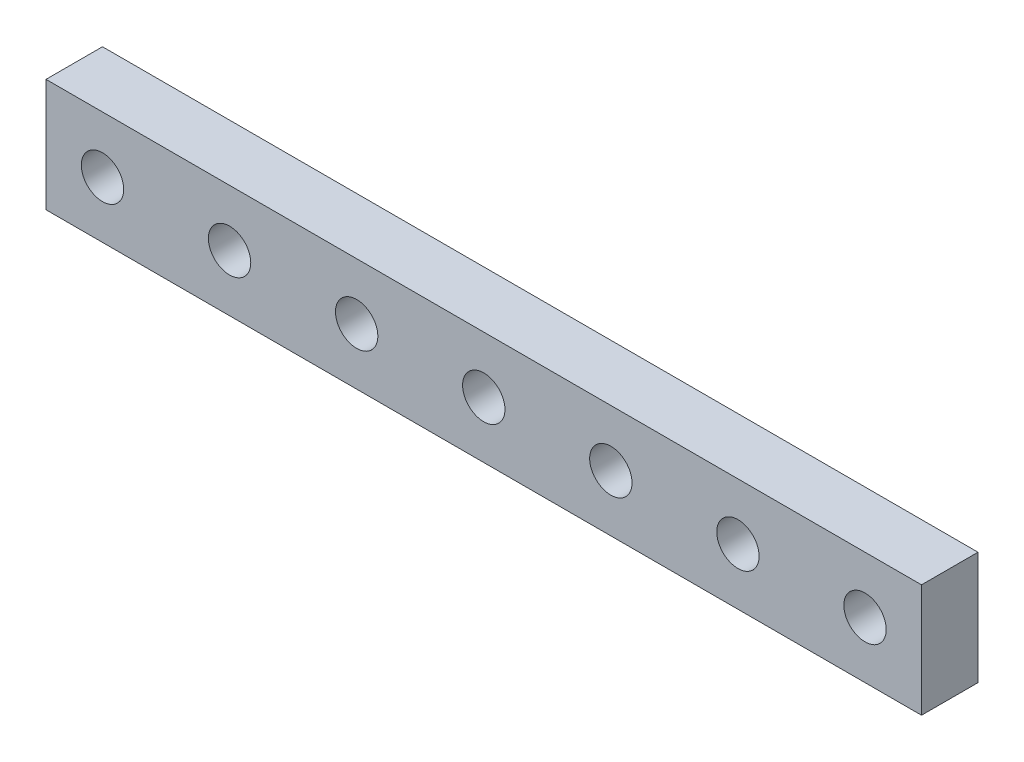
ISO-10303-21;
HEADER;
FILE_DESCRIPTION(('STEP AP214'),'2;1');
FILE_NAME('part.step','',(''),(''),'','','');
FILE_SCHEMA(('AUTOMOTIVE_DESIGN { 1 0 10303 214 1 1 1 1 }'));
ENDSEC;
DATA;
#1=APPLICATION_CONTEXT('core data for automotive mechanical design processes');
#2=APPLICATION_PROTOCOL_DEFINITION('international standard','automotive_design',2000,#1);
#3=PRODUCT_CONTEXT('',#1,'mechanical');
#4=PRODUCT('Part','Part','',(#3));
#5=PRODUCT_RELATED_PRODUCT_CATEGORY('part','',(#4));
#6=PRODUCT_DEFINITION_FORMATION('','',#4);
#7=PRODUCT_DEFINITION_CONTEXT('part definition',#1,'design');
#8=PRODUCT_DEFINITION('design','',#6,#7);
#9=PRODUCT_DEFINITION_SHAPE('','',#8);
#10=(LENGTH_UNIT() NAMED_UNIT(*) SI_UNIT(.MILLI.,.METRE.));
#11=(NAMED_UNIT(*) PLANE_ANGLE_UNIT() SI_UNIT($,.RADIAN.));
#12=(NAMED_UNIT(*) SI_UNIT($,.STERADIAN.) SOLID_ANGLE_UNIT());
#13=UNCERTAINTY_MEASURE_WITH_UNIT(LENGTH_MEASURE(1.E-05),#10,'distance_accuracy_value','');
#14=(GEOMETRIC_REPRESENTATION_CONTEXT(3) GLOBAL_UNCERTAINTY_ASSIGNED_CONTEXT((#13)) GLOBAL_UNIT_ASSIGNED_CONTEXT((#10,
#11,#12)) REPRESENTATION_CONTEXT('',''));
#15=CARTESIAN_POINT('',(0.,0.,0.));
#16=DIRECTION('',(0.,0.,1.));
#17=DIRECTION('',(1.,0.,0.));
#18=AXIS2_PLACEMENT_3D('',#15,#16,#17);
#19=CARTESIAN_POINT('',(0.,0.,4.));
#20=DIRECTION('',(0.,0.,-1.));
#21=DIRECTION('',(-1.,0.,0.));
#22=AXIS2_PLACEMENT_3D('',#19,#20,#21);
#23=PLANE('',#22);
#24=DIRECTION('',(0.,-1.,0.));
#25=VECTOR('',#24,1.);
#26=CARTESIAN_POINT('',(2551.34180854864,1588.06769153812,4.));
#27=LINE('',#26,#25);
#28=CARTESIAN_POINT('',(2551.34180854864,1596.06769153812,4.));
#29=VERTEX_POINT('',#28);
#30=CARTESIAN_POINT('',(2551.34180854864,1588.06769153812,4.));
#31=VERTEX_POINT('',#30);
#32=EDGE_CURVE('E89',#29,#31,#27,.T.);
#33=ORIENTED_EDGE('',*,*,#32,.T.);
#34=DIRECTION('',(1.,0.,0.));
#35=VECTOR('',#34,1.);
#36=CARTESIAN_POINT('',(2613.34180854864,1588.06769153812,4.));
#37=LINE('',#36,#35);
#38=CARTESIAN_POINT('',(2613.34180854864,1588.06769153812,4.));
#39=VERTEX_POINT('',#38);
#40=EDGE_CURVE('E84',#31,#39,#37,.T.);
#41=ORIENTED_EDGE('',*,*,#40,.T.);
#42=DIRECTION('',(0.,1.,0.));
#43=VECTOR('',#42,1.);
#44=CARTESIAN_POINT('',(2613.34180854864,1596.06769153812,4.));
#45=LINE('',#44,#43);
#46=CARTESIAN_POINT('',(2613.34180854864,1596.06769153812,4.));
#47=VERTEX_POINT('',#46);
#48=EDGE_CURVE('E87',#39,#47,#45,.T.);
#49=ORIENTED_EDGE('',*,*,#48,.T.);
#50=DIRECTION('',(-1.,0.,0.));
#51=VECTOR('',#50,1.);
#52=CARTESIAN_POINT('',(2551.34180854864,1596.06769153812,4.));
#53=LINE('',#52,#51);
#54=EDGE_CURVE('E54',#47,#29,#53,.T.);
#55=ORIENTED_EDGE('',*,*,#54,.T.);
#56=EDGE_LOOP('',(#33,#41,#49,#55));
#57=FACE_BOUND('',#56,.T.);
#58=CARTESIAN_POINT('',(2555.34180854864,1592.06769153812,4.));
#59=DIRECTION('',(0.,0.,1.));
#60=DIRECTION('',(1.,0.,0.));
#61=AXIS2_PLACEMENT_3D('',#58,#59,#60);
#62=CIRCLE('',#61,1.50000000000006);
#63=CARTESIAN_POINT('',(2556.84180854864,1592.06769153812,4.));
#64=VERTEX_POINT('',#63);
#65=EDGE_CURVE('E104',#64,#64,#62,.T.);
#66=ORIENTED_EDGE('',*,*,#65,.F.);
#67=EDGE_LOOP('',(#66));
#68=FACE_BOUND('',#67,.T.);
#69=CARTESIAN_POINT('',(2564.34180854864,1592.06769153812,4.));
#70=DIRECTION('',(0.,0.,1.));
#71=DIRECTION('',(1.,0.,0.));
#72=AXIS2_PLACEMENT_3D('',#69,#70,#71);
#73=CIRCLE('',#72,1.50000000000006);
#74=CARTESIAN_POINT('',(2565.84180854864,1592.06769153812,4.));
#75=VERTEX_POINT('',#74);
#76=EDGE_CURVE('E119',#75,#75,#73,.T.);
#77=ORIENTED_EDGE('',*,*,#76,.F.);
#78=EDGE_LOOP('',(#77));
#79=FACE_BOUND('',#78,.T.);
#80=CARTESIAN_POINT('',(2573.34180854864,1592.06769153812,4.));
#81=DIRECTION('',(0.,0.,1.));
#82=DIRECTION('',(1.,0.,0.));
#83=AXIS2_PLACEMENT_3D('',#80,#81,#82);
#84=CIRCLE('',#83,1.50000000000006);
#85=CARTESIAN_POINT('',(2574.84180854864,1592.06769153812,4.));
#86=VERTEX_POINT('',#85);
#87=EDGE_CURVE('E125',#86,#86,#84,.T.);
#88=ORIENTED_EDGE('',*,*,#87,.F.);
#89=EDGE_LOOP('',(#88));
#90=FACE_BOUND('',#89,.T.);
#91=CARTESIAN_POINT('',(2582.34180854864,1592.06769153812,4.));
#92=DIRECTION('',(0.,0.,1.));
#93=DIRECTION('',(1.,0.,0.));
#94=AXIS2_PLACEMENT_3D('',#91,#92,#93);
#95=CIRCLE('',#94,1.50000000000006);
#96=CARTESIAN_POINT('',(2583.84180854864,1592.06769153812,4.));
#97=VERTEX_POINT('',#96);
#98=EDGE_CURVE('E131',#97,#97,#95,.T.);
#99=ORIENTED_EDGE('',*,*,#98,.F.);
#100=EDGE_LOOP('',(#99));
#101=FACE_BOUND('',#100,.T.);
#102=CARTESIAN_POINT('',(2591.34180854864,1592.06769153812,4.));
#103=DIRECTION('',(0.,0.,1.));
#104=DIRECTION('',(1.,0.,0.));
#105=AXIS2_PLACEMENT_3D('',#102,#103,#104);
#106=CIRCLE('',#105,1.50000000000006);
#107=CARTESIAN_POINT('',(2592.84180854864,1592.06769153812,4.));
#108=VERTEX_POINT('',#107);
#109=EDGE_CURVE('E137',#108,#108,#106,.T.);
#110=ORIENTED_EDGE('',*,*,#109,.F.);
#111=EDGE_LOOP('',(#110));
#112=FACE_BOUND('',#111,.T.);
#113=CARTESIAN_POINT('',(2600.34180854864,1592.06769153812,4.));
#114=DIRECTION('',(0.,0.,1.));
#115=DIRECTION('',(1.,0.,0.));
#116=AXIS2_PLACEMENT_3D('',#113,#114,#115);
#117=CIRCLE('',#116,1.50000000000006);
#118=CARTESIAN_POINT('',(2601.84180854864,1592.06769153812,4.));
#119=VERTEX_POINT('',#118);
#120=EDGE_CURVE('E143',#119,#119,#117,.T.);
#121=ORIENTED_EDGE('',*,*,#120,.F.);
#122=EDGE_LOOP('',(#121));
#123=FACE_BOUND('',#122,.T.);
#124=CARTESIAN_POINT('',(2609.34180854864,1592.06769153812,4.));
#125=DIRECTION('',(0.,0.,1.));
#126=DIRECTION('',(1.,0.,0.));
#127=AXIS2_PLACEMENT_3D('',#124,#125,#126);
#128=CIRCLE('',#127,1.50000000000006);
#129=CARTESIAN_POINT('',(2610.84180854864,1592.06769153812,4.));
#130=VERTEX_POINT('',#129);
#131=EDGE_CURVE('E149',#130,#130,#128,.T.);
#132=ORIENTED_EDGE('',*,*,#131,.F.);
#133=EDGE_LOOP('',(#132));
#134=FACE_BOUND('',#133,.T.);
#135=ADVANCED_FACE('F37',(#57,#68,#79,#90,#101,#112,#123,#134),#23,.F.);
#136=CARTESIAN_POINT('',(0.,0.,0.));
#137=DIRECTION('',(0.,0.,-1.));
#138=DIRECTION('',(-1.,0.,0.));
#139=AXIS2_PLACEMENT_3D('',#136,#137,#138);
#140=PLANE('',#139);
#141=CARTESIAN_POINT('',(2600.34180854864,1592.06769153812,0.));
#142=DIRECTION('',(0.,0.,1.));
#143=DIRECTION('',(1.,0.,0.));
#144=AXIS2_PLACEMENT_3D('',#141,#142,#143);
#145=CIRCLE('',#144,1.50000000000006);
#146=CARTESIAN_POINT('',(2601.84180854864,1592.06769153812,0.));
#147=VERTEX_POINT('',#146);
#148=EDGE_CURVE('E146',#147,#147,#145,.T.);
#149=ORIENTED_EDGE('',*,*,#148,.T.);
#150=EDGE_LOOP('',(#149));
#151=FACE_BOUND('',#150,.T.);
#152=CARTESIAN_POINT('',(2582.34180854864,1592.06769153812,0.));
#153=DIRECTION('',(0.,0.,1.));
#154=DIRECTION('',(1.,0.,0.));
#155=AXIS2_PLACEMENT_3D('',#152,#153,#154);
#156=CIRCLE('',#155,1.50000000000006);
#157=CARTESIAN_POINT('',(2583.84180854864,1592.06769153812,0.));
#158=VERTEX_POINT('',#157);
#159=EDGE_CURVE('E134',#158,#158,#156,.T.);
#160=ORIENTED_EDGE('',*,*,#159,.T.);
#161=EDGE_LOOP('',(#160));
#162=FACE_BOUND('',#161,.T.);
#163=CARTESIAN_POINT('',(2564.34180854864,1592.06769153812,0.));
#164=DIRECTION('',(0.,0.,1.));
#165=DIRECTION('',(1.,0.,0.));
#166=AXIS2_PLACEMENT_3D('',#163,#164,#165);
#167=CIRCLE('',#166,1.50000000000006);
#168=CARTESIAN_POINT('',(2565.84180854864,1592.06769153812,0.));
#169=VERTEX_POINT('',#168);
#170=EDGE_CURVE('E122',#169,#169,#167,.T.);
#171=ORIENTED_EDGE('',*,*,#170,.T.);
#172=EDGE_LOOP('',(#171));
#173=FACE_BOUND('',#172,.T.);
#174=DIRECTION('',(0.,-1.,0.));
#175=VECTOR('',#174,1.);
#176=CARTESIAN_POINT('',(2551.34180854864,1588.06769153812,0.));
#177=LINE('',#176,#175);
#178=CARTESIAN_POINT('',(2551.34180854864,1596.06769153812,0.));
#179=VERTEX_POINT('',#178);
#180=CARTESIAN_POINT('',(2551.34180854864,1588.06769153812,0.));
#181=VERTEX_POINT('',#180);
#182=EDGE_CURVE('E101',#179,#181,#177,.T.);
#183=ORIENTED_EDGE('',*,*,#182,.F.);
#184=DIRECTION('',(-1.,0.,0.));
#185=VECTOR('',#184,1.);
#186=CARTESIAN_POINT('',(2551.34180854864,1596.06769153812,0.));
#187=LINE('',#186,#185);
#188=CARTESIAN_POINT('',(2613.34180854864,1596.06769153812,0.));
#189=VERTEX_POINT('',#188);
#190=EDGE_CURVE('E77',#189,#179,#187,.T.);
#191=ORIENTED_EDGE('',*,*,#190,.F.);
#192=DIRECTION('',(0.,1.,0.));
#193=VECTOR('',#192,1.);
#194=CARTESIAN_POINT('',(2613.34180854864,1596.06769153812,0.));
#195=LINE('',#194,#193);
#196=CARTESIAN_POINT('',(2613.34180854864,1588.06769153812,0.));
#197=VERTEX_POINT('',#196);
#198=EDGE_CURVE('E71',#197,#189,#195,.T.);
#199=ORIENTED_EDGE('',*,*,#198,.F.);
#200=DIRECTION('',(1.,0.,0.));
#201=VECTOR('',#200,1.);
#202=CARTESIAN_POINT('',(2613.34180854864,1588.06769153812,0.));
#203=LINE('',#202,#201);
#204=EDGE_CURVE('E93',#181,#197,#203,.T.);
#205=ORIENTED_EDGE('',*,*,#204,.F.);
#206=EDGE_LOOP('',(#183,#191,#199,#205));
#207=FACE_BOUND('',#206,.T.);
#208=CARTESIAN_POINT('',(2555.34180854864,1592.06769153812,0.));
#209=DIRECTION('',(0.,0.,1.));
#210=DIRECTION('',(1.,0.,0.));
#211=AXIS2_PLACEMENT_3D('',#208,#209,#210);
#212=CIRCLE('',#211,1.50000000000006);
#213=CARTESIAN_POINT('',(2556.84180854864,1592.06769153812,0.));
#214=VERTEX_POINT('',#213);
#215=EDGE_CURVE('E116',#214,#214,#212,.T.);
#216=ORIENTED_EDGE('',*,*,#215,.T.);
#217=EDGE_LOOP('',(#216));
#218=FACE_BOUND('',#217,.T.);
#219=CARTESIAN_POINT('',(2573.34180854864,1592.06769153812,0.));
#220=DIRECTION('',(0.,0.,1.));
#221=DIRECTION('',(1.,0.,0.));
#222=AXIS2_PLACEMENT_3D('',#219,#220,#221);
#223=CIRCLE('',#222,1.50000000000006);
#224=CARTESIAN_POINT('',(2574.84180854864,1592.06769153812,0.));
#225=VERTEX_POINT('',#224);
#226=EDGE_CURVE('E128',#225,#225,#223,.T.);
#227=ORIENTED_EDGE('',*,*,#226,.T.);
#228=EDGE_LOOP('',(#227));
#229=FACE_BOUND('',#228,.T.);
#230=CARTESIAN_POINT('',(2591.34180854864,1592.06769153812,0.));
#231=DIRECTION('',(0.,0.,1.));
#232=DIRECTION('',(1.,0.,0.));
#233=AXIS2_PLACEMENT_3D('',#230,#231,#232);
#234=CIRCLE('',#233,1.50000000000006);
#235=CARTESIAN_POINT('',(2592.84180854864,1592.06769153812,0.));
#236=VERTEX_POINT('',#235);
#237=EDGE_CURVE('E140',#236,#236,#234,.T.);
#238=ORIENTED_EDGE('',*,*,#237,.T.);
#239=EDGE_LOOP('',(#238));
#240=FACE_BOUND('',#239,.T.);
#241=CARTESIAN_POINT('',(2609.34180854864,1592.06769153812,0.));
#242=DIRECTION('',(0.,0.,1.));
#243=DIRECTION('',(1.,0.,0.));
#244=AXIS2_PLACEMENT_3D('',#241,#242,#243);
#245=CIRCLE('',#244,1.50000000000006);
#246=CARTESIAN_POINT('',(2610.84180854864,1592.06769153812,0.));
#247=VERTEX_POINT('',#246);
#248=EDGE_CURVE('E152',#247,#247,#245,.T.);
#249=ORIENTED_EDGE('',*,*,#248,.T.);
#250=EDGE_LOOP('',(#249));
#251=FACE_BOUND('',#250,.T.);
#252=ADVANCED_FACE('F112',(#151,#162,#173,#207,#218,#229,#240,#251),#140,.T.);
#253=CARTESIAN_POINT('',(2551.34180854864,1588.06769153812,4.));
#254=DIRECTION('',(1.,0.,0.));
#255=DIRECTION('',(0.,0.,-1.));
#256=AXIS2_PLACEMENT_3D('',#253,#254,#255);
#257=PLANE('',#256);
#258=ORIENTED_EDGE('',*,*,#182,.T.);
#259=DIRECTION('',(0.,0.,-1.));
#260=VECTOR('',#259,1.);
#261=CARTESIAN_POINT('',(2551.34180854864,1588.06769153812,4.));
#262=LINE('',#261,#260);
#263=EDGE_CURVE('E11',#31,#181,#262,.T.);
#264=ORIENTED_EDGE('',*,*,#263,.F.);
#265=ORIENTED_EDGE('',*,*,#32,.F.);
#266=DIRECTION('',(0.,0.,-1.));
#267=VECTOR('',#266,1.);
#268=CARTESIAN_POINT('',(2551.34180854864,1596.06769153812,4.));
#269=LINE('',#268,#267);
#270=EDGE_CURVE('E97',#29,#179,#269,.T.);
#271=ORIENTED_EDGE('',*,*,#270,.T.);
#272=EDGE_LOOP('',(#258,#264,#265,#271));
#273=FACE_BOUND('',#272,.T.);
#274=ADVANCED_FACE('F39',(#273),#257,.F.);
#275=CARTESIAN_POINT('',(2613.34180854864,1588.06769153812,4.));
#276=DIRECTION('',(0.,1.,0.));
#277=DIRECTION('',(-1.,0.,0.));
#278=AXIS2_PLACEMENT_3D('',#275,#276,#277);
#279=PLANE('',#278);
#280=ORIENTED_EDGE('',*,*,#204,.T.);
#281=DIRECTION('',(0.,0.,-1.));
#282=VECTOR('',#281,1.);
#283=CARTESIAN_POINT('',(2613.34180854864,1588.06769153812,4.));
#284=LINE('',#283,#282);
#285=EDGE_CURVE('E46',#39,#197,#284,.T.);
#286=ORIENTED_EDGE('',*,*,#285,.F.);
#287=ORIENTED_EDGE('',*,*,#40,.F.);
#288=ORIENTED_EDGE('',*,*,#263,.T.);
#289=EDGE_LOOP('',(#280,#286,#287,#288));
#290=FACE_BOUND('',#289,.T.);
#291=ADVANCED_FACE('F92',(#290),#279,.F.);
#292=CARTESIAN_POINT('',(2613.34180854864,1596.06769153812,4.));
#293=DIRECTION('',(-1.,0.,0.));
#294=DIRECTION('',(0.,0.,1.));
#295=AXIS2_PLACEMENT_3D('',#292,#293,#294);
#296=PLANE('',#295);
#297=ORIENTED_EDGE('',*,*,#198,.T.);
#298=DIRECTION('',(0.,0.,-1.));
#299=VECTOR('',#298,1.);
#300=CARTESIAN_POINT('',(2613.34180854864,1596.06769153812,4.));
#301=LINE('',#300,#299);
#302=EDGE_CURVE('E94',#47,#189,#301,.T.);
#303=ORIENTED_EDGE('',*,*,#302,.F.);
#304=ORIENTED_EDGE('',*,*,#48,.F.);
#305=ORIENTED_EDGE('',*,*,#285,.T.);
#306=EDGE_LOOP('',(#297,#303,#304,#305));
#307=FACE_BOUND('',#306,.T.);
#308=ADVANCED_FACE('F95',(#307),#296,.F.);
#309=CARTESIAN_POINT('',(2551.34180854864,1596.06769153812,4.));
#310=DIRECTION('',(0.,-1.,0.));
#311=DIRECTION('',(0.,0.,-1.));
#312=AXIS2_PLACEMENT_3D('',#309,#310,#311);
#313=PLANE('',#312);
#314=ORIENTED_EDGE('',*,*,#190,.T.);
#315=ORIENTED_EDGE('',*,*,#270,.F.);
#316=ORIENTED_EDGE('',*,*,#54,.F.);
#317=ORIENTED_EDGE('',*,*,#302,.T.);
#318=EDGE_LOOP('',(#314,#315,#316,#317));
#319=FACE_BOUND('',#318,.T.);
#320=ADVANCED_FACE('F109',(#319),#313,.F.);
#321=CARTESIAN_POINT('',(2555.34180854864,1592.06769153812,4.));
#322=DIRECTION('',(0.,0.,-1.));
#323=DIRECTION('',(-1.,0.,0.));
#324=AXIS2_PLACEMENT_3D('',#321,#322,#323);
#325=CYLINDRICAL_SURFACE('',#324,1.50000000000006);
#326=ORIENTED_EDGE('',*,*,#65,.T.);
#327=EDGE_LOOP('',(#326));
#328=FACE_BOUND('',#327,.T.);
#329=ORIENTED_EDGE('',*,*,#215,.F.);
#330=EDGE_LOOP('',(#329));
#331=FACE_BOUND('',#330,.T.);
#332=ADVANCED_FACE('F169',(#328,#331),#325,.F.);
#333=CARTESIAN_POINT('',(2564.34180854864,1592.06769153812,4.));
#334=DIRECTION('',(0.,0.,-1.));
#335=DIRECTION('',(-1.,0.,0.));
#336=AXIS2_PLACEMENT_3D('',#333,#334,#335);
#337=CYLINDRICAL_SURFACE('',#336,1.50000000000006);
#338=ORIENTED_EDGE('',*,*,#76,.T.);
#339=EDGE_LOOP('',(#338));
#340=FACE_BOUND('',#339,.T.);
#341=ORIENTED_EDGE('',*,*,#170,.F.);
#342=EDGE_LOOP('',(#341));
#343=FACE_BOUND('',#342,.T.);
#344=ADVANCED_FACE('F223',(#340,#343),#337,.F.);
#345=CARTESIAN_POINT('',(2573.34180854864,1592.06769153812,4.));
#346=DIRECTION('',(0.,0.,-1.));
#347=DIRECTION('',(-1.,0.,0.));
#348=AXIS2_PLACEMENT_3D('',#345,#346,#347);
#349=CYLINDRICAL_SURFACE('',#348,1.50000000000006);
#350=ORIENTED_EDGE('',*,*,#87,.T.);
#351=EDGE_LOOP('',(#350));
#352=FACE_BOUND('',#351,.T.);
#353=ORIENTED_EDGE('',*,*,#226,.F.);
#354=EDGE_LOOP('',(#353));
#355=FACE_BOUND('',#354,.T.);
#356=ADVANCED_FACE('F232',(#352,#355),#349,.F.);
#357=CARTESIAN_POINT('',(2582.34180854864,1592.06769153812,4.));
#358=DIRECTION('',(0.,0.,-1.));
#359=DIRECTION('',(-1.,0.,0.));
#360=AXIS2_PLACEMENT_3D('',#357,#358,#359);
#361=CYLINDRICAL_SURFACE('',#360,1.50000000000006);
#362=ORIENTED_EDGE('',*,*,#98,.T.);
#363=EDGE_LOOP('',(#362));
#364=FACE_BOUND('',#363,.T.);
#365=ORIENTED_EDGE('',*,*,#159,.F.);
#366=EDGE_LOOP('',(#365));
#367=FACE_BOUND('',#366,.T.);
#368=ADVANCED_FACE('F241',(#364,#367),#361,.F.);
#369=CARTESIAN_POINT('',(2591.34180854864,1592.06769153812,4.));
#370=DIRECTION('',(0.,0.,-1.));
#371=DIRECTION('',(-1.,0.,0.));
#372=AXIS2_PLACEMENT_3D('',#369,#370,#371);
#373=CYLINDRICAL_SURFACE('',#372,1.50000000000006);
#374=ORIENTED_EDGE('',*,*,#109,.T.);
#375=EDGE_LOOP('',(#374));
#376=FACE_BOUND('',#375,.T.);
#377=ORIENTED_EDGE('',*,*,#237,.F.);
#378=EDGE_LOOP('',(#377));
#379=FACE_BOUND('',#378,.T.);
#380=ADVANCED_FACE('F251',(#376,#379),#373,.F.);
#381=CARTESIAN_POINT('',(2600.34180854864,1592.06769153812,4.));
#382=DIRECTION('',(0.,0.,-1.));
#383=DIRECTION('',(-1.,0.,0.));
#384=AXIS2_PLACEMENT_3D('',#381,#382,#383);
#385=CYLINDRICAL_SURFACE('',#384,1.50000000000006);
#386=ORIENTED_EDGE('',*,*,#120,.T.);
#387=EDGE_LOOP('',(#386));
#388=FACE_BOUND('',#387,.T.);
#389=ORIENTED_EDGE('',*,*,#148,.F.);
#390=EDGE_LOOP('',(#389));
#391=FACE_BOUND('',#390,.T.);
#392=ADVANCED_FACE('F261',(#388,#391),#385,.F.);
#393=CARTESIAN_POINT('',(2609.34180854864,1592.06769153812,4.));
#394=DIRECTION('',(0.,0.,-1.));
#395=DIRECTION('',(-1.,0.,0.));
#396=AXIS2_PLACEMENT_3D('',#393,#394,#395);
#397=CYLINDRICAL_SURFACE('',#396,1.50000000000006);
#398=ORIENTED_EDGE('',*,*,#131,.T.);
#399=EDGE_LOOP('',(#398));
#400=FACE_BOUND('',#399,.T.);
#401=ORIENTED_EDGE('',*,*,#248,.F.);
#402=EDGE_LOOP('',(#401));
#403=FACE_BOUND('',#402,.T.);
#404=ADVANCED_FACE('F158',(#400,#403),#397,.F.);
#405=CLOSED_SHELL('',(#135,#252,#274,#291,#308,#320,#332,#344,#356,#368,#380,#392,#404));
#406=MANIFOLD_SOLID_BREP('B2',#405);
#407=ADVANCED_BREP_SHAPE_REPRESENTATION('',(#18,#406),#14);
#408=SHAPE_DEFINITION_REPRESENTATION(#9,#407);
ENDSEC;
END-ISO-10303-21;
